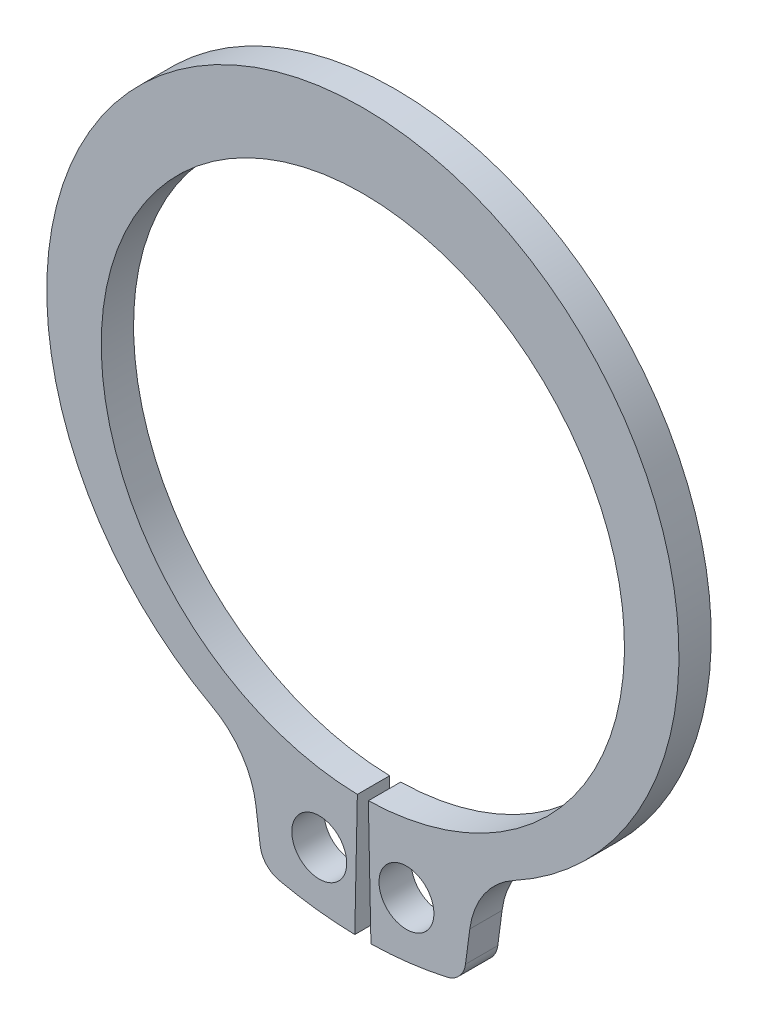
ISO-10303-21;
HEADER;
FILE_DESCRIPTION(('STEP AP214'),'2;1');
FILE_NAME('part.step','',(''),(''),'','','');
FILE_SCHEMA(('AUTOMOTIVE_DESIGN { 1 0 10303 214 1 1 1 1 }'));
ENDSEC;
DATA;
#1=APPLICATION_CONTEXT('core data for automotive mechanical design processes');
#2=APPLICATION_PROTOCOL_DEFINITION('international standard','automotive_design',2000,#1);
#3=PRODUCT_CONTEXT('',#1,'mechanical');
#4=PRODUCT('Part','Part','',(#3));
#5=PRODUCT_RELATED_PRODUCT_CATEGORY('part','',(#4));
#6=PRODUCT_DEFINITION_FORMATION('','',#4);
#7=PRODUCT_DEFINITION_CONTEXT('part definition',#1,'design');
#8=PRODUCT_DEFINITION('design','',#6,#7);
#9=PRODUCT_DEFINITION_SHAPE('','',#8);
#10=(LENGTH_UNIT() NAMED_UNIT(*) SI_UNIT(.MILLI.,.METRE.));
#11=(NAMED_UNIT(*) PLANE_ANGLE_UNIT() SI_UNIT($,.RADIAN.));
#12=(NAMED_UNIT(*) SI_UNIT($,.STERADIAN.) SOLID_ANGLE_UNIT());
#13=UNCERTAINTY_MEASURE_WITH_UNIT(LENGTH_MEASURE(1.E-05),#10,'distance_accuracy_value','');
#14=(GEOMETRIC_REPRESENTATION_CONTEXT(3) GLOBAL_UNCERTAINTY_ASSIGNED_CONTEXT((#13)) GLOBAL_UNIT_ASSIGNED_CONTEXT((#10,
#11,#12)) REPRESENTATION_CONTEXT('',''));
#15=CARTESIAN_POINT('',(0.,0.,0.));
#16=DIRECTION('',(0.,0.,1.));
#17=DIRECTION('',(1.,0.,0.));
#18=AXIS2_PLACEMENT_3D('',#15,#16,#17);
#19=CARTESIAN_POINT('',(0.,0.,-1.));
#20=DIRECTION('',(0.,0.,1.));
#21=DIRECTION('',(1.,0.,0.));
#22=AXIS2_PLACEMENT_3D('',#19,#20,#21);
#23=CYLINDRICAL_SURFACE('',#22,8.1);
#24=CARTESIAN_POINT('',(0.,0.,0.));
#25=DIRECTION('',(0.,0.,-1.));
#26=DIRECTION('',(1.,0.,0.));
#27=AXIS2_PLACEMENT_3D('',#24,#25,#26);
#28=CIRCLE('',#27,8.1);
#29=CARTESIAN_POINT('',(-0.170168067226891,-8.09821232303131,0.));
#30=VERTEX_POINT('',#29);
#31=CARTESIAN_POINT('',(0.170168067226891,-8.09821232303132,0.));
#32=VERTEX_POINT('',#31);
#33=EDGE_CURVE('E120',#30,#32,#28,.T.);
#34=ORIENTED_EDGE('',*,*,#33,.F.);
#35=DIRECTION('',(0.,0.,1.));
#36=VECTOR('',#35,1.);
#37=CARTESIAN_POINT('',(-0.170168067226891,-8.09821232303131,-1.));
#38=LINE('',#37,#36);
#39=CARTESIAN_POINT('',(-0.170168067226891,-8.09821232303131,-1.));
#40=VERTEX_POINT('',#39);
#41=EDGE_CURVE('E11',#40,#30,#38,.T.);
#42=ORIENTED_EDGE('',*,*,#41,.F.);
#43=CARTESIAN_POINT('',(0.,0.,-1.));
#44=DIRECTION('',(0.,0.,-1.));
#45=DIRECTION('',(1.,0.,0.));
#46=AXIS2_PLACEMENT_3D('',#43,#44,#45);
#47=CIRCLE('',#46,8.1);
#48=CARTESIAN_POINT('',(0.170168067226891,-8.09821232303132,-1.));
#49=VERTEX_POINT('',#48);
#50=EDGE_CURVE('E122',#40,#49,#47,.T.);
#51=ORIENTED_EDGE('',*,*,#50,.T.);
#52=DIRECTION('',(0.,0.,1.));
#53=VECTOR('',#52,1.);
#54=CARTESIAN_POINT('',(0.170168067226891,-8.09821232303132,-1.));
#55=LINE('',#54,#53);
#56=EDGE_CURVE('E35',#49,#32,#55,.T.);
#57=ORIENTED_EDGE('',*,*,#56,.T.);
#58=EDGE_LOOP('',(#34,#42,#51,#57));
#59=FACE_BOUND('',#58,.T.);
#60=ADVANCED_FACE('F32',(#59),#23,.F.);
#61=CARTESIAN_POINT('',(-0.170168067226891,-8.09821232303131,-1.));
#62=DIRECTION('',(0.999779299139669,-0.0210084033613445,0.));
#63=DIRECTION('',(0.0210084033613445,0.999779299139669,0.));
#64=AXIS2_PLACEMENT_3D('',#61,#62,#63);
#65=PLANE('',#64);
#66=DIRECTION('',(0.0210084033613445,0.999779299139669,0.));
#67=VECTOR('',#66,1.);
#68=CARTESIAN_POINT('',(-0.170168067226891,-8.09821232303131,0.));
#69=LINE('',#68,#67);
#70=CARTESIAN_POINT('',(-0.25,-11.8973736597621,0.));
#71=VERTEX_POINT('',#70);
#72=EDGE_CURVE('E138',#71,#30,#69,.T.);
#73=ORIENTED_EDGE('',*,*,#72,.F.);
#74=DIRECTION('',(0.,0.,1.));
#75=VECTOR('',#74,1.);
#76=CARTESIAN_POINT('',(-0.25,-11.8973736597621,-1.));
#77=LINE('',#76,#75);
#78=CARTESIAN_POINT('',(-0.25,-11.8973736597621,-1.));
#79=VERTEX_POINT('',#78);
#80=EDGE_CURVE('E40',#79,#71,#77,.T.);
#81=ORIENTED_EDGE('',*,*,#80,.F.);
#82=DIRECTION('',(0.0210084033613445,0.999779299139669,0.));
#83=VECTOR('',#82,1.);
#84=CARTESIAN_POINT('',(-0.170168067226891,-8.09821232303131,-1.));
#85=LINE('',#84,#83);
#86=EDGE_CURVE('E127',#79,#40,#85,.T.);
#87=ORIENTED_EDGE('',*,*,#86,.T.);
#88=ORIENTED_EDGE('',*,*,#41,.T.);
#89=EDGE_LOOP('',(#73,#81,#87,#88));
#90=FACE_BOUND('',#89,.T.);
#91=ADVANCED_FACE('F250',(#90),#65,.T.);
#92=CARTESIAN_POINT('',(0.,0.,-1.));
#93=DIRECTION('',(0.,0.,1.));
#94=DIRECTION('',(1.,0.,0.));
#95=AXIS2_PLACEMENT_3D('',#92,#93,#94);
#96=CYLINDRICAL_SURFACE('',#95,11.9);
#97=CARTESIAN_POINT('',(0.,0.,0.));
#98=DIRECTION('',(0.,0.,1.));
#99=DIRECTION('',(1.,0.,0.));
#100=AXIS2_PLACEMENT_3D('',#97,#98,#99);
#101=CIRCLE('',#100,11.9);
#102=CARTESIAN_POINT('',(-2.59786641108392,-11.6129707702277,0.));
#103=VERTEX_POINT('',#102);
#104=EDGE_CURVE('E168',#103,#71,#101,.T.);
#105=ORIENTED_EDGE('',*,*,#104,.F.);
#106=DIRECTION('',(0.,0.,1.));
#107=VECTOR('',#106,1.);
#108=CARTESIAN_POINT('',(-2.59786641108392,-11.6129707702277,-1.));
#109=LINE('',#108,#107);
#110=CARTESIAN_POINT('',(-2.59786641108392,-11.6129707702277,-1.));
#111=VERTEX_POINT('',#110);
#112=EDGE_CURVE('E202',#111,#103,#109,.T.);
#113=ORIENTED_EDGE('',*,*,#112,.F.);
#114=CARTESIAN_POINT('',(0.,0.,-1.));
#115=DIRECTION('',(0.,0.,1.));
#116=DIRECTION('',(1.,0.,0.));
#117=AXIS2_PLACEMENT_3D('',#114,#115,#116);
#118=CIRCLE('',#117,11.9);
#119=EDGE_CURVE('E198',#111,#79,#118,.T.);
#120=ORIENTED_EDGE('',*,*,#119,.T.);
#121=ORIENTED_EDGE('',*,*,#80,.T.);
#122=EDGE_LOOP('',(#105,#113,#120,#121));
#123=FACE_BOUND('',#122,.T.);
#124=ADVANCED_FACE('F255',(#123),#96,.T.);
#125=CARTESIAN_POINT('',(-2.4341353347551,-10.8810608477343,-1.));
#126=DIRECTION('',(0.,0.,1.));
#127=DIRECTION('',(1.,0.,0.));
#128=AXIS2_PLACEMENT_3D('',#125,#126,#127);
#129=CYLINDRICAL_SURFACE('',#128,0.749999999999999);
#130=CARTESIAN_POINT('',(-2.4341353347551,-10.8810608477343,0.));
#131=DIRECTION('',(0.,0.,1.));
#132=DIRECTION('',(1.,0.,0.));
#133=AXIS2_PLACEMENT_3D('',#130,#131,#132);
#134=CIRCLE('',#133,0.749999999999999);
#135=CARTESIAN_POINT('',(-3.17771898078546,-10.9789554918994,0.));
#136=VERTEX_POINT('',#135);
#137=EDGE_CURVE('E165',#136,#103,#134,.T.);
#138=ORIENTED_EDGE('',*,*,#137,.F.);
#139=DIRECTION('',(0.,0.,1.));
#140=VECTOR('',#139,1.);
#141=CARTESIAN_POINT('',(-3.17771898078546,-10.9789554918994,-1.));
#142=LINE('',#141,#140);
#143=CARTESIAN_POINT('',(-3.17771898078546,-10.9789554918994,-1.));
#144=VERTEX_POINT('',#143);
#145=EDGE_CURVE('E204',#144,#136,#142,.T.);
#146=ORIENTED_EDGE('',*,*,#145,.F.);
#147=CARTESIAN_POINT('',(-2.4341353347551,-10.8810608477343,-1.));
#148=DIRECTION('',(0.,0.,1.));
#149=DIRECTION('',(1.,0.,0.));
#150=AXIS2_PLACEMENT_3D('',#147,#148,#149);
#151=CIRCLE('',#150,0.749999999999999);
#152=EDGE_CURVE('E195',#144,#111,#151,.T.);
#153=ORIENTED_EDGE('',*,*,#152,.T.);
#154=ORIENTED_EDGE('',*,*,#112,.T.);
#155=EDGE_LOOP('',(#138,#146,#153,#154));
#156=FACE_BOUND('',#155,.T.);
#157=ADVANCED_FACE('F247',(#156),#129,.T.);
#158=CARTESIAN_POINT('',(-3.31090492950541,-9.96730777415253,-1.));
#159=DIRECTION('',(-0.99144486137381,-0.130526192220053,0.));
#160=DIRECTION('',(0.130526192220053,-0.99144486137381,0.));
#161=AXIS2_PLACEMENT_3D('',#158,#159,#160);
#162=PLANE('',#161);
#163=DIRECTION('',(0.130526192220053,-0.99144486137381,0.));
#164=VECTOR('',#163,1.);
#165=CARTESIAN_POINT('',(-3.31090492950541,-9.96730777415253,0.));
#166=LINE('',#165,#164);
#167=CARTESIAN_POINT('',(-3.31090492950541,-9.96730777415253,0.));
#168=VERTEX_POINT('',#167);
#169=EDGE_CURVE('E162',#168,#136,#166,.T.);
#170=ORIENTED_EDGE('',*,*,#169,.F.);
#171=DIRECTION('',(0.,0.,1.));
#172=VECTOR('',#171,1.);
#173=CARTESIAN_POINT('',(-3.31090492950541,-9.96730777415253,-1.));
#174=LINE('',#173,#172);
#175=CARTESIAN_POINT('',(-3.31090492950541,-9.96730777415253,-1.));
#176=VERTEX_POINT('',#175);
#177=EDGE_CURVE('E206',#176,#168,#174,.T.);
#178=ORIENTED_EDGE('',*,*,#177,.F.);
#179=DIRECTION('',(0.130526192220053,-0.99144486137381,0.));
#180=VECTOR('',#179,1.);
#181=CARTESIAN_POINT('',(-3.31090492950541,-9.96730777415253,-1.));
#182=LINE('',#181,#180);
#183=EDGE_CURVE('E192',#176,#144,#182,.T.);
#184=ORIENTED_EDGE('',*,*,#183,.T.);
#185=ORIENTED_EDGE('',*,*,#145,.T.);
#186=EDGE_LOOP('',(#170,#178,#184,#185));
#187=FACE_BOUND('',#186,.T.);
#188=ADVANCED_FACE('F243',(#187),#162,.T.);
#189=CARTESIAN_POINT('',(-5.93722222071591,-10.3130690049974,-1.));
#190=DIRECTION('',(0.,0.,1.));
#191=DIRECTION('',(1.,0.,0.));
#192=AXIS2_PLACEMENT_3D('',#189,#190,#191);
#193=CYLINDRICAL_SURFACE('',#192,2.64897967958733);
#194=CARTESIAN_POINT('',(-5.93722222071591,-10.3130690049974,0.));
#195=DIRECTION('',(0.,0.,-1.));
#196=DIRECTION('',(1.,0.,0.));
#197=AXIS2_PLACEMENT_3D('',#194,#195,#196);
#198=CIRCLE('',#197,2.64897967958733);
#199=CARTESIAN_POINT('',(-4.67248626665764,-7.98550884264304,0.));
#200=VERTEX_POINT('',#199);
#201=EDGE_CURVE('E159',#200,#168,#198,.T.);
#202=ORIENTED_EDGE('',*,*,#201,.F.);
#203=DIRECTION('',(0.,0.,1.));
#204=VECTOR('',#203,1.);
#205=CARTESIAN_POINT('',(-4.67248626665764,-7.98550884264304,-1.));
#206=LINE('',#205,#204);
#207=CARTESIAN_POINT('',(-4.67248626665764,-7.98550884264304,-1.));
#208=VERTEX_POINT('',#207);
#209=EDGE_CURVE('E208',#208,#200,#206,.T.);
#210=ORIENTED_EDGE('',*,*,#209,.F.);
#211=CARTESIAN_POINT('',(-5.93722222071591,-10.3130690049974,-1.));
#212=DIRECTION('',(0.,0.,-1.));
#213=DIRECTION('',(1.,0.,0.));
#214=AXIS2_PLACEMENT_3D('',#211,#212,#213);
#215=CIRCLE('',#214,2.64897967958733);
#216=EDGE_CURVE('E189',#208,#176,#215,.T.);
#217=ORIENTED_EDGE('',*,*,#216,.T.);
#218=ORIENTED_EDGE('',*,*,#177,.T.);
#219=EDGE_LOOP('',(#202,#210,#217,#218));
#220=FACE_BOUND('',#219,.T.);
#221=ADVANCED_FACE('F239',(#220),#193,.F.);
#222=CARTESIAN_POINT('',(0.,0.613513631987205,-1.));
#223=DIRECTION('',(0.,0.,1.));
#224=DIRECTION('',(1.,0.,0.));
#225=AXIS2_PLACEMENT_3D('',#222,#223,#224);
#226=CYLINDRICAL_SURFACE('',#225,9.78648636801279);
#227=CARTESIAN_POINT('',(0.,0.613513631987205,0.));
#228=DIRECTION('',(0.,0.,1.));
#229=DIRECTION('',(1.,0.,0.));
#230=AXIS2_PLACEMENT_3D('',#227,#228,#229);
#231=CIRCLE('',#230,9.78648636801279);
#232=CARTESIAN_POINT('',(4.67248626665764,-7.98550884264304,0.));
#233=VERTEX_POINT('',#232);
#234=EDGE_CURVE('E156',#233,#200,#231,.T.);
#235=ORIENTED_EDGE('',*,*,#234,.F.);
#236=DIRECTION('',(0.,0.,1.));
#237=VECTOR('',#236,1.);
#238=CARTESIAN_POINT('',(4.67248626665764,-7.98550884264304,-1.));
#239=LINE('',#238,#237);
#240=CARTESIAN_POINT('',(4.67248626665764,-7.98550884264304,-1.));
#241=VERTEX_POINT('',#240);
#242=EDGE_CURVE('E210',#241,#233,#239,.T.);
#243=ORIENTED_EDGE('',*,*,#242,.F.);
#244=CARTESIAN_POINT('',(0.,0.613513631987205,-1.));
#245=DIRECTION('',(0.,0.,1.));
#246=DIRECTION('',(1.,0.,0.));
#247=AXIS2_PLACEMENT_3D('',#244,#245,#246);
#248=CIRCLE('',#247,9.78648636801279);
#249=EDGE_CURVE('E186',#241,#208,#248,.T.);
#250=ORIENTED_EDGE('',*,*,#249,.T.);
#251=ORIENTED_EDGE('',*,*,#209,.T.);
#252=EDGE_LOOP('',(#235,#243,#250,#251));
#253=FACE_BOUND('',#252,.T.);
#254=ADVANCED_FACE('F235',(#253),#226,.T.);
#255=CARTESIAN_POINT('',(5.93722222071592,-10.3130690049974,-1.));
#256=DIRECTION('',(0.,0.,1.));
#257=DIRECTION('',(1.,0.,0.));
#258=AXIS2_PLACEMENT_3D('',#255,#256,#257);
#259=CYLINDRICAL_SURFACE('',#258,2.64897967958733);
#260=CARTESIAN_POINT('',(5.93722222071592,-10.3130690049974,0.));
#261=DIRECTION('',(0.,0.,-1.));
#262=DIRECTION('',(1.,0.,0.));
#263=AXIS2_PLACEMENT_3D('',#260,#261,#262);
#264=CIRCLE('',#263,2.64897967958733);
#265=CARTESIAN_POINT('',(3.31090492950542,-9.96730777415253,0.));
#266=VERTEX_POINT('',#265);
#267=EDGE_CURVE('E153',#266,#233,#264,.T.);
#268=ORIENTED_EDGE('',*,*,#267,.F.);
#269=DIRECTION('',(0.,0.,1.));
#270=VECTOR('',#269,1.);
#271=CARTESIAN_POINT('',(3.31090492950542,-9.96730777415253,-1.));
#272=LINE('',#271,#270);
#273=CARTESIAN_POINT('',(3.31090492950542,-9.96730777415253,-1.));
#274=VERTEX_POINT('',#273);
#275=EDGE_CURVE('E212',#274,#266,#272,.T.);
#276=ORIENTED_EDGE('',*,*,#275,.F.);
#277=CARTESIAN_POINT('',(5.93722222071592,-10.3130690049974,-1.));
#278=DIRECTION('',(0.,0.,-1.));
#279=DIRECTION('',(1.,0.,0.));
#280=AXIS2_PLACEMENT_3D('',#277,#278,#279);
#281=CIRCLE('',#280,2.64897967958733);
#282=EDGE_CURVE('E183',#274,#241,#281,.T.);
#283=ORIENTED_EDGE('',*,*,#282,.T.);
#284=ORIENTED_EDGE('',*,*,#242,.T.);
#285=EDGE_LOOP('',(#268,#276,#283,#284));
#286=FACE_BOUND('',#285,.T.);
#287=ADVANCED_FACE('F231',(#286),#259,.F.);
#288=CARTESIAN_POINT('',(3.31090492950541,-9.96730777415253,-1.));
#289=DIRECTION('',(0.99144486137381,-0.130526192220053,0.));
#290=DIRECTION('',(0.130526192220053,0.99144486137381,0.));
#291=AXIS2_PLACEMENT_3D('',#288,#289,#290);
#292=PLANE('',#291);
#293=DIRECTION('',(0.130526192220053,0.99144486137381,0.));
#294=VECTOR('',#293,1.);
#295=CARTESIAN_POINT('',(3.31090492950541,-9.96730777415253,0.));
#296=LINE('',#295,#294);
#297=CARTESIAN_POINT('',(3.17771898078545,-10.9789554918994,0.));
#298=VERTEX_POINT('',#297);
#299=EDGE_CURVE('E150',#298,#266,#296,.T.);
#300=ORIENTED_EDGE('',*,*,#299,.F.);
#301=DIRECTION('',(0.,0.,1.));
#302=VECTOR('',#301,1.);
#303=CARTESIAN_POINT('',(3.17771898078545,-10.9789554918994,-1.));
#304=LINE('',#303,#302);
#305=CARTESIAN_POINT('',(3.17771898078545,-10.9789554918994,-1.));
#306=VERTEX_POINT('',#305);
#307=EDGE_CURVE('E214',#306,#298,#304,.T.);
#308=ORIENTED_EDGE('',*,*,#307,.F.);
#309=DIRECTION('',(0.130526192220053,0.99144486137381,0.));
#310=VECTOR('',#309,1.);
#311=CARTESIAN_POINT('',(3.31090492950541,-9.96730777415253,-1.));
#312=LINE('',#311,#310);
#313=EDGE_CURVE('E180',#306,#274,#312,.T.);
#314=ORIENTED_EDGE('',*,*,#313,.T.);
#315=ORIENTED_EDGE('',*,*,#275,.T.);
#316=EDGE_LOOP('',(#300,#308,#314,#315));
#317=FACE_BOUND('',#316,.T.);
#318=ADVANCED_FACE('F227',(#317),#292,.T.);
#319=CARTESIAN_POINT('',(2.4341353347551,-10.8810608477343,-1.));
#320=DIRECTION('',(0.,0.,1.));
#321=DIRECTION('',(1.,0.,0.));
#322=AXIS2_PLACEMENT_3D('',#319,#320,#321);
#323=CYLINDRICAL_SURFACE('',#322,0.749999999999999);
#324=CARTESIAN_POINT('',(2.4341353347551,-10.8810608477343,0.));
#325=DIRECTION('',(0.,0.,1.));
#326=DIRECTION('',(-1.,0.,0.));
#327=AXIS2_PLACEMENT_3D('',#324,#325,#326);
#328=CIRCLE('',#327,0.749999999999999);
#329=CARTESIAN_POINT('',(2.59786641108392,-11.6129707702277,0.));
#330=VERTEX_POINT('',#329);
#331=EDGE_CURVE('E147',#330,#298,#328,.T.);
#332=ORIENTED_EDGE('',*,*,#331,.F.);
#333=DIRECTION('',(0.,0.,1.));
#334=VECTOR('',#333,1.);
#335=CARTESIAN_POINT('',(2.59786641108392,-11.6129707702277,-1.));
#336=LINE('',#335,#334);
#337=CARTESIAN_POINT('',(2.59786641108392,-11.6129707702277,-1.));
#338=VERTEX_POINT('',#337);
#339=EDGE_CURVE('E216',#338,#330,#336,.T.);
#340=ORIENTED_EDGE('',*,*,#339,.F.);
#341=CARTESIAN_POINT('',(2.4341353347551,-10.8810608477343,-1.));
#342=DIRECTION('',(0.,0.,1.));
#343=DIRECTION('',(-1.,0.,0.));
#344=AXIS2_PLACEMENT_3D('',#341,#342,#343);
#345=CIRCLE('',#344,0.749999999999999);
#346=EDGE_CURVE('E177',#338,#306,#345,.T.);
#347=ORIENTED_EDGE('',*,*,#346,.T.);
#348=ORIENTED_EDGE('',*,*,#307,.T.);
#349=EDGE_LOOP('',(#332,#340,#347,#348));
#350=FACE_BOUND('',#349,.T.);
#351=ADVANCED_FACE('F223',(#350),#323,.T.);
#352=CARTESIAN_POINT('',(0.,0.,-1.));
#353=DIRECTION('',(0.,0.,1.));
#354=DIRECTION('',(1.,0.,0.));
#355=AXIS2_PLACEMENT_3D('',#352,#353,#354);
#356=CYLINDRICAL_SURFACE('',#355,11.9);
#357=CARTESIAN_POINT('',(0.,0.,0.));
#358=DIRECTION('',(0.,0.,1.));
#359=DIRECTION('',(1.,0.,0.));
#360=AXIS2_PLACEMENT_3D('',#357,#358,#359);
#361=CIRCLE('',#360,11.9);
#362=CARTESIAN_POINT('',(0.250000000000002,-11.8973736597621,0.));
#363=VERTEX_POINT('',#362);
#364=EDGE_CURVE('E134',#363,#330,#361,.T.);
#365=ORIENTED_EDGE('',*,*,#364,.F.);
#366=DIRECTION('',(0.,0.,1.));
#367=VECTOR('',#366,1.);
#368=CARTESIAN_POINT('',(0.250000000000002,-11.8973736597621,-1.));
#369=LINE('',#368,#367);
#370=CARTESIAN_POINT('',(0.250000000000002,-11.8973736597621,-1.));
#371=VERTEX_POINT('',#370);
#372=EDGE_CURVE('E126',#371,#363,#369,.T.);
#373=ORIENTED_EDGE('',*,*,#372,.F.);
#374=CARTESIAN_POINT('',(0.,0.,-1.));
#375=DIRECTION('',(0.,0.,1.));
#376=DIRECTION('',(1.,0.,0.));
#377=AXIS2_PLACEMENT_3D('',#374,#375,#376);
#378=CIRCLE('',#377,11.9);
#379=EDGE_CURVE('E174',#371,#338,#378,.T.);
#380=ORIENTED_EDGE('',*,*,#379,.T.);
#381=ORIENTED_EDGE('',*,*,#339,.T.);
#382=EDGE_LOOP('',(#365,#373,#380,#381));
#383=FACE_BOUND('',#382,.T.);
#384=ADVANCED_FACE('F219',(#383),#356,.T.);
#385=CARTESIAN_POINT('',(0.170168067226891,-8.09821232303132,-1.));
#386=DIRECTION('',(-0.999779299139669,-0.0210084033613445,0.));
#387=DIRECTION('',(0.0210084033613445,-0.999779299139669,0.));
#388=AXIS2_PLACEMENT_3D('',#385,#386,#387);
#389=PLANE('',#388);
#390=DIRECTION('',(0.0210084033613445,-0.999779299139669,0.));
#391=VECTOR('',#390,1.);
#392=CARTESIAN_POINT('',(0.170168067226891,-8.09821232303132,0.));
#393=LINE('',#392,#391);
#394=EDGE_CURVE('E129',#32,#363,#393,.T.);
#395=ORIENTED_EDGE('',*,*,#394,.F.);
#396=ORIENTED_EDGE('',*,*,#56,.F.);
#397=DIRECTION('',(0.0210084033613445,-0.999779299139669,0.));
#398=VECTOR('',#397,1.);
#399=CARTESIAN_POINT('',(0.170168067226891,-8.09821232303132,-1.));
#400=LINE('',#399,#398);
#401=EDGE_CURVE('E172',#49,#371,#400,.T.);
#402=ORIENTED_EDGE('',*,*,#401,.T.);
#403=ORIENTED_EDGE('',*,*,#372,.T.);
#404=EDGE_LOOP('',(#395,#396,#402,#403));
#405=FACE_BOUND('',#404,.T.);
#406=ADVANCED_FACE('F130',(#405),#389,.T.);
#407=CARTESIAN_POINT('',(0.,0.,-1.));
#408=DIRECTION('',(0.,0.,1.));
#409=DIRECTION('',(1.,0.,0.));
#410=AXIS2_PLACEMENT_3D('',#407,#408,#409);
#411=PLANE('',#410);
#412=CARTESIAN_POINT('',(-1.35,-10.1102670587873,-1.));
#413=DIRECTION('',(0.,0.,1.));
#414=DIRECTION('',(1.,0.,0.));
#415=AXIS2_PLACEMENT_3D('',#412,#413,#414);
#416=CIRCLE('',#415,0.85);
#417=CARTESIAN_POINT('',(-0.500000000000001,-10.1102670587873,-1.));
#418=VERTEX_POINT('',#417);
#419=EDGE_CURVE('E389',#418,#418,#416,.T.);
#420=ORIENTED_EDGE('',*,*,#419,.T.);
#421=EDGE_LOOP('',(#420));
#422=FACE_BOUND('',#421,.T.);
#423=CARTESIAN_POINT('',(1.35,-10.1102670587873,-1.));
#424=DIRECTION('',(0.,0.,1.));
#425=DIRECTION('',(1.,0.,0.));
#426=AXIS2_PLACEMENT_3D('',#423,#424,#425);
#427=CIRCLE('',#426,0.85);
#428=CARTESIAN_POINT('',(2.2,-10.1102670587873,-1.));
#429=VERTEX_POINT('',#428);
#430=EDGE_CURVE('E139',#429,#429,#427,.T.);
#431=ORIENTED_EDGE('',*,*,#430,.T.);
#432=EDGE_LOOP('',(#431));
#433=FACE_BOUND('',#432,.T.);
#434=ORIENTED_EDGE('',*,*,#50,.F.);
#435=ORIENTED_EDGE('',*,*,#86,.F.);
#436=ORIENTED_EDGE('',*,*,#119,.F.);
#437=ORIENTED_EDGE('',*,*,#152,.F.);
#438=ORIENTED_EDGE('',*,*,#183,.F.);
#439=ORIENTED_EDGE('',*,*,#216,.F.);
#440=ORIENTED_EDGE('',*,*,#249,.F.);
#441=ORIENTED_EDGE('',*,*,#282,.F.);
#442=ORIENTED_EDGE('',*,*,#313,.F.);
#443=ORIENTED_EDGE('',*,*,#346,.F.);
#444=ORIENTED_EDGE('',*,*,#379,.F.);
#445=ORIENTED_EDGE('',*,*,#401,.F.);
#446=EDGE_LOOP('',(#434,#435,#436,#437,#438,#439,#440,#441,#442,#443,#444,#445));
#447=FACE_BOUND('',#446,.T.);
#448=ADVANCED_FACE('F254',(#422,#433,#447),#411,.F.);
#449=CARTESIAN_POINT('',(0.,0.,0.));
#450=DIRECTION('',(0.,0.,1.));
#451=DIRECTION('',(1.,0.,0.));
#452=AXIS2_PLACEMENT_3D('',#449,#450,#451);
#453=PLANE('',#452);
#454=CARTESIAN_POINT('',(-1.35,-10.1102670587873,0.));
#455=DIRECTION('',(0.,0.,1.));
#456=DIRECTION('',(1.,0.,0.));
#457=AXIS2_PLACEMENT_3D('',#454,#455,#456);
#458=CIRCLE('',#457,0.85);
#459=CARTESIAN_POINT('',(-0.5,-10.1102670587873,0.));
#460=VERTEX_POINT('',#459);
#461=EDGE_CURVE('E392',#460,#460,#458,.T.);
#462=ORIENTED_EDGE('',*,*,#461,.F.);
#463=EDGE_LOOP('',(#462));
#464=FACE_BOUND('',#463,.T.);
#465=CARTESIAN_POINT('',(1.35,-10.1102670587873,0.));
#466=DIRECTION('',(0.,0.,1.));
#467=DIRECTION('',(1.,0.,0.));
#468=AXIS2_PLACEMENT_3D('',#465,#466,#467);
#469=CIRCLE('',#468,0.85);
#470=CARTESIAN_POINT('',(2.2,-10.1102670587873,0.));
#471=VERTEX_POINT('',#470);
#472=EDGE_CURVE('E142',#471,#471,#469,.T.);
#473=ORIENTED_EDGE('',*,*,#472,.F.);
#474=EDGE_LOOP('',(#473));
#475=FACE_BOUND('',#474,.T.);
#476=ORIENTED_EDGE('',*,*,#33,.T.);
#477=ORIENTED_EDGE('',*,*,#394,.T.);
#478=ORIENTED_EDGE('',*,*,#364,.T.);
#479=ORIENTED_EDGE('',*,*,#331,.T.);
#480=ORIENTED_EDGE('',*,*,#299,.T.);
#481=ORIENTED_EDGE('',*,*,#267,.T.);
#482=ORIENTED_EDGE('',*,*,#234,.T.);
#483=ORIENTED_EDGE('',*,*,#201,.T.);
#484=ORIENTED_EDGE('',*,*,#169,.T.);
#485=ORIENTED_EDGE('',*,*,#137,.T.);
#486=ORIENTED_EDGE('',*,*,#104,.T.);
#487=ORIENTED_EDGE('',*,*,#72,.T.);
#488=EDGE_LOOP('',(#476,#477,#478,#479,#480,#481,#482,#483,#484,#485,#486,#487));
#489=FACE_BOUND('',#488,.T.);
#490=ADVANCED_FACE('F136',(#464,#475,#489),#453,.T.);
#491=CARTESIAN_POINT('',(1.35,-10.1102670587873,-1.));
#492=DIRECTION('',(0.,0.,1.));
#493=DIRECTION('',(1.,0.,0.));
#494=AXIS2_PLACEMENT_3D('',#491,#492,#493);
#495=CYLINDRICAL_SURFACE('',#494,0.85);
#496=ORIENTED_EDGE('',*,*,#430,.F.);
#497=EDGE_LOOP('',(#496));
#498=FACE_BOUND('',#497,.T.);
#499=ORIENTED_EDGE('',*,*,#472,.T.);
#500=EDGE_LOOP('',(#499));
#501=FACE_BOUND('',#500,.T.);
#502=ADVANCED_FACE('F362',(#498,#501),#495,.F.);
#503=CARTESIAN_POINT('',(-1.35,-10.1102670587873,-1.));
#504=DIRECTION('',(0.,0.,1.));
#505=DIRECTION('',(1.,0.,0.));
#506=AXIS2_PLACEMENT_3D('',#503,#504,#505);
#507=CYLINDRICAL_SURFACE('',#506,0.85);
#508=ORIENTED_EDGE('',*,*,#419,.F.);
#509=EDGE_LOOP('',(#508));
#510=FACE_BOUND('',#509,.T.);
#511=ORIENTED_EDGE('',*,*,#461,.T.);
#512=EDGE_LOOP('',(#511));
#513=FACE_BOUND('',#512,.T.);
#514=ADVANCED_FACE('F372',(#510,#513),#507,.F.);
#515=CLOSED_SHELL('',(#60,#91,#124,#157,#188,#221,#254,#287,#318,#351,#384,#406,#448,#490,#502,#514));
#516=MANIFOLD_SOLID_BREP('B2',#515);
#517=ADVANCED_BREP_SHAPE_REPRESENTATION('',(#18,#516),#14);
#518=SHAPE_DEFINITION_REPRESENTATION(#9,#517);
ENDSEC;
END-ISO-10303-21;
